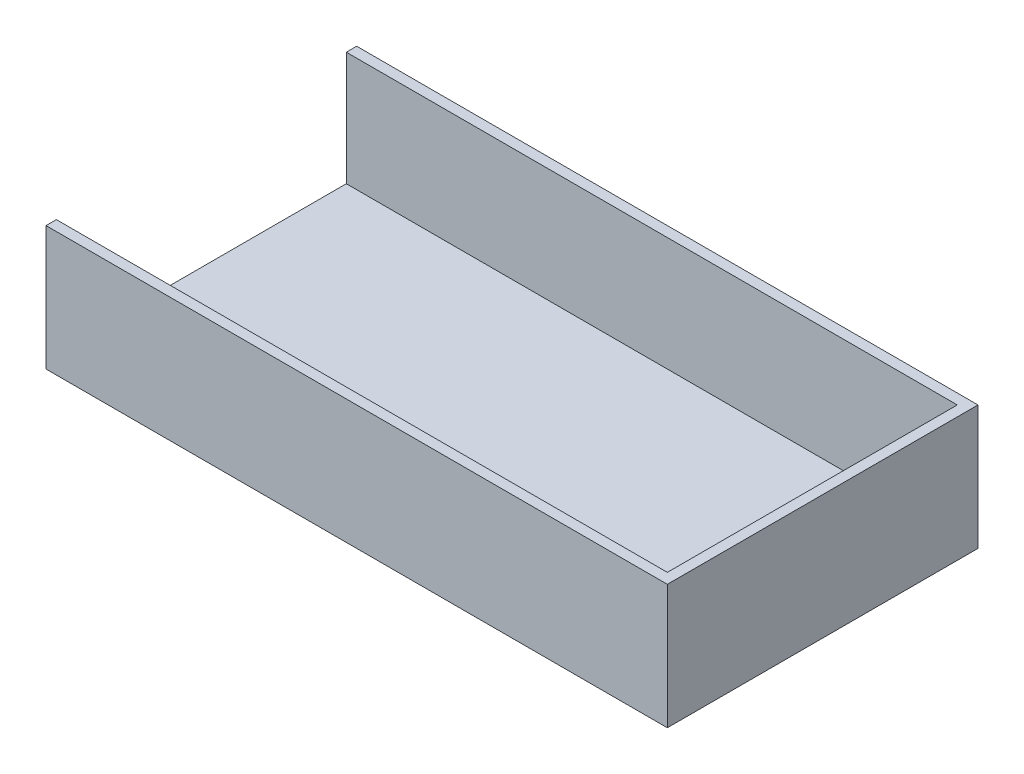
ISO-10303-21;
HEADER;
FILE_DESCRIPTION(('STEP AP214'),'2;1');
FILE_NAME('part.step','',(''),(''),'','','');
FILE_SCHEMA(('AUTOMOTIVE_DESIGN { 1 0 10303 214 1 1 1 1 }'));
ENDSEC;
DATA;
#1=APPLICATION_CONTEXT('core data for automotive mechanical design processes');
#2=APPLICATION_PROTOCOL_DEFINITION('international standard','automotive_design',2000,#1);
#3=PRODUCT_CONTEXT('',#1,'mechanical');
#4=PRODUCT('Part','Part','',(#3));
#5=PRODUCT_RELATED_PRODUCT_CATEGORY('part','',(#4));
#6=PRODUCT_DEFINITION_FORMATION('','',#4);
#7=PRODUCT_DEFINITION_CONTEXT('part definition',#1,'design');
#8=PRODUCT_DEFINITION('design','',#6,#7);
#9=PRODUCT_DEFINITION_SHAPE('','',#8);
#10=(LENGTH_UNIT() NAMED_UNIT(*) SI_UNIT(.MILLI.,.METRE.));
#11=(NAMED_UNIT(*) PLANE_ANGLE_UNIT() SI_UNIT($,.RADIAN.));
#12=(NAMED_UNIT(*) SI_UNIT($,.STERADIAN.) SOLID_ANGLE_UNIT());
#13=UNCERTAINTY_MEASURE_WITH_UNIT(LENGTH_MEASURE(1.E-05),#10,'distance_accuracy_value','');
#14=(GEOMETRIC_REPRESENTATION_CONTEXT(3) GLOBAL_UNCERTAINTY_ASSIGNED_CONTEXT((#13)) GLOBAL_UNIT_ASSIGNED_CONTEXT((#10,
#11,#12)) REPRESENTATION_CONTEXT('',''));
#15=CARTESIAN_POINT('',(0.,0.,0.));
#16=DIRECTION('',(0.,0.,1.));
#17=DIRECTION('',(1.,0.,0.));
#18=AXIS2_PLACEMENT_3D('',#15,#16,#17);
#19=CARTESIAN_POINT('',(0.,15.,35.));
#20=DIRECTION('',(0.,0.,1.));
#21=DIRECTION('',(1.,0.,0.));
#22=AXIS2_PLACEMENT_3D('',#19,#20,#21);
#23=PLANE('',#22);
#24=DIRECTION('',(-1.,0.,0.));
#25=VECTOR('',#24,1.);
#26=CARTESIAN_POINT('',(0.,-12.5,35.));
#27=LINE('',#26,#25);
#28=CARTESIAN_POINT('',(72.5,-12.5,35.));
#29=VERTEX_POINT('',#28);
#30=CARTESIAN_POINT('',(-75.,-12.5,35.));
#31=VERTEX_POINT('',#30);
#32=EDGE_CURVE('E53',#29,#31,#27,.T.);
#33=ORIENTED_EDGE('',*,*,#32,.T.);
#34=DIRECTION('',(0.,-1.,0.));
#35=VECTOR('',#34,1.);
#36=CARTESIAN_POINT('',(-75.,15.,35.));
#37=LINE('',#36,#35);
#38=CARTESIAN_POINT('',(-75.,15.,35.));
#39=VERTEX_POINT('',#38);
#40=EDGE_CURVE('E11',#39,#31,#37,.T.);
#41=ORIENTED_EDGE('',*,*,#40,.F.);
#42=DIRECTION('',(-1.,0.,0.));
#43=VECTOR('',#42,1.);
#44=CARTESIAN_POINT('',(0.,15.,35.));
#45=LINE('',#44,#43);
#46=CARTESIAN_POINT('',(72.5,15.,35.));
#47=VERTEX_POINT('',#46);
#48=EDGE_CURVE('E113',#47,#39,#45,.T.);
#49=ORIENTED_EDGE('',*,*,#48,.F.);
#50=DIRECTION('',(0.,-1.,0.));
#51=VECTOR('',#50,1.);
#52=CARTESIAN_POINT('',(72.5,15.,35.));
#53=LINE('',#52,#51);
#54=EDGE_CURVE('E174',#47,#29,#53,.T.);
#55=ORIENTED_EDGE('',*,*,#54,.T.);
#56=EDGE_LOOP('',(#33,#41,#49,#55));
#57=FACE_BOUND('',#56,.T.);
#58=ADVANCED_FACE('F39',(#57),#23,.F.);
#59=CARTESIAN_POINT('',(0.,15.,-35.));
#60=DIRECTION('',(0.,0.,1.));
#61=DIRECTION('',(1.,0.,0.));
#62=AXIS2_PLACEMENT_3D('',#59,#60,#61);
#63=PLANE('',#62);
#64=DIRECTION('',(0.,-1.,0.));
#65=VECTOR('',#64,1.);
#66=CARTESIAN_POINT('',(-75.,15.,-35.));
#67=LINE('',#66,#65);
#68=CARTESIAN_POINT('',(-75.,15.,-35.));
#69=VERTEX_POINT('',#68);
#70=CARTESIAN_POINT('',(-75.,-12.5,-35.));
#71=VERTEX_POINT('',#70);
#72=EDGE_CURVE('E60',#69,#71,#67,.T.);
#73=ORIENTED_EDGE('',*,*,#72,.T.);
#74=DIRECTION('',(-1.,0.,0.));
#75=VECTOR('',#74,1.);
#76=CARTESIAN_POINT('',(0.,-12.5,-35.));
#77=LINE('',#76,#75);
#78=CARTESIAN_POINT('',(72.5,-12.5,-35.));
#79=VERTEX_POINT('',#78);
#80=EDGE_CURVE('E163',#79,#71,#77,.T.);
#81=ORIENTED_EDGE('',*,*,#80,.F.);
#82=DIRECTION('',(0.,-1.,0.));
#83=VECTOR('',#82,1.);
#84=CARTESIAN_POINT('',(72.5,15.,-35.));
#85=LINE('',#84,#83);
#86=CARTESIAN_POINT('',(72.5,15.,-35.));
#87=VERTEX_POINT('',#86);
#88=EDGE_CURVE('E176',#87,#79,#85,.T.);
#89=ORIENTED_EDGE('',*,*,#88,.F.);
#90=DIRECTION('',(-1.,0.,0.));
#91=VECTOR('',#90,1.);
#92=CARTESIAN_POINT('',(0.,15.,-35.));
#93=LINE('',#92,#91);
#94=EDGE_CURVE('E193',#87,#69,#93,.T.);
#95=ORIENTED_EDGE('',*,*,#94,.T.);
#96=EDGE_LOOP('',(#73,#81,#89,#95));
#97=FACE_BOUND('',#96,.T.);
#98=ADVANCED_FACE('F125',(#97),#63,.T.);
#99=CARTESIAN_POINT('',(72.5,15.,0.));
#100=DIRECTION('',(1.,0.,0.));
#101=DIRECTION('',(0.,0.,-1.));
#102=AXIS2_PLACEMENT_3D('',#99,#100,#101);
#103=PLANE('',#102);
#104=DIRECTION('',(0.,0.,1.));
#105=VECTOR('',#104,1.);
#106=CARTESIAN_POINT('',(72.5,-12.5,0.));
#107=LINE('',#106,#105);
#108=EDGE_CURVE('E198',#79,#29,#107,.T.);
#109=ORIENTED_EDGE('',*,*,#108,.T.);
#110=ORIENTED_EDGE('',*,*,#54,.F.);
#111=DIRECTION('',(0.,0.,1.));
#112=VECTOR('',#111,1.);
#113=CARTESIAN_POINT('',(72.5,15.,0.));
#114=LINE('',#113,#112);
#115=EDGE_CURVE('E120',#87,#47,#114,.T.);
#116=ORIENTED_EDGE('',*,*,#115,.F.);
#117=ORIENTED_EDGE('',*,*,#88,.T.);
#118=EDGE_LOOP('',(#109,#110,#116,#117));
#119=FACE_BOUND('',#118,.T.);
#120=ADVANCED_FACE('F130',(#119),#103,.F.);
#121=CARTESIAN_POINT('',(0.,15.,37.5));
#122=DIRECTION('',(0.,0.,-1.));
#123=DIRECTION('',(-1.,0.,0.));
#124=AXIS2_PLACEMENT_3D('',#121,#122,#123);
#125=PLANE('',#124);
#126=DIRECTION('',(1.,0.,0.));
#127=VECTOR('',#126,1.);
#128=CARTESIAN_POINT('',(0.,-15.,37.5));
#129=LINE('',#128,#127);
#130=CARTESIAN_POINT('',(-75.,-15.,37.5));
#131=VERTEX_POINT('',#130);
#132=CARTESIAN_POINT('',(75.,-15.,37.5));
#133=VERTEX_POINT('',#132);
#134=EDGE_CURVE('E156',#131,#133,#129,.T.);
#135=ORIENTED_EDGE('',*,*,#134,.T.);
#136=DIRECTION('',(0.,-1.,0.));
#137=VECTOR('',#136,1.);
#138=CARTESIAN_POINT('',(75.,15.,37.5));
#139=LINE('',#138,#137);
#140=CARTESIAN_POINT('',(75.,15.,37.5));
#141=VERTEX_POINT('',#140);
#142=EDGE_CURVE('E158',#141,#133,#139,.T.);
#143=ORIENTED_EDGE('',*,*,#142,.F.);
#144=DIRECTION('',(1.,0.,0.));
#145=VECTOR('',#144,1.);
#146=CARTESIAN_POINT('',(0.,15.,37.5));
#147=LINE('',#146,#145);
#148=CARTESIAN_POINT('',(-75.,15.,37.5));
#149=VERTEX_POINT('',#148);
#150=EDGE_CURVE('E112',#149,#141,#147,.T.);
#151=ORIENTED_EDGE('',*,*,#150,.F.);
#152=DIRECTION('',(0.,-1.,0.));
#153=VECTOR('',#152,1.);
#154=CARTESIAN_POINT('',(-75.,15.,37.5));
#155=LINE('',#154,#153);
#156=EDGE_CURVE('E46',#149,#131,#155,.T.);
#157=ORIENTED_EDGE('',*,*,#156,.T.);
#158=EDGE_LOOP('',(#135,#143,#151,#157));
#159=FACE_BOUND('',#158,.T.);
#160=ADVANCED_FACE('F135',(#159),#125,.F.);
#161=CARTESIAN_POINT('',(75.,15.,0.));
#162=DIRECTION('',(1.,0.,0.));
#163=DIRECTION('',(0.,0.,-1.));
#164=AXIS2_PLACEMENT_3D('',#161,#162,#163);
#165=PLANE('',#164);
#166=DIRECTION('',(0.,0.,1.));
#167=VECTOR('',#166,1.);
#168=CARTESIAN_POINT('',(75.,-15.,0.));
#169=LINE('',#168,#167);
#170=CARTESIAN_POINT('',(75.,-15.,-37.5));
#171=VERTEX_POINT('',#170);
#172=EDGE_CURVE('E162',#171,#133,#169,.T.);
#173=ORIENTED_EDGE('',*,*,#172,.F.);
#174=DIRECTION('',(0.,-1.,0.));
#175=VECTOR('',#174,1.);
#176=CARTESIAN_POINT('',(75.,15.,-37.5));
#177=LINE('',#176,#175);
#178=CARTESIAN_POINT('',(75.,15.,-37.5));
#179=VERTEX_POINT('',#178);
#180=EDGE_CURVE('E182',#179,#171,#177,.T.);
#181=ORIENTED_EDGE('',*,*,#180,.F.);
#182=DIRECTION('',(0.,0.,1.));
#183=VECTOR('',#182,1.);
#184=CARTESIAN_POINT('',(75.,15.,0.));
#185=LINE('',#184,#183);
#186=EDGE_CURVE('E185',#179,#141,#185,.T.);
#187=ORIENTED_EDGE('',*,*,#186,.T.);
#188=ORIENTED_EDGE('',*,*,#142,.T.);
#189=EDGE_LOOP('',(#173,#181,#187,#188));
#190=FACE_BOUND('',#189,.T.);
#191=ADVANCED_FACE('F145',(#190),#165,.T.);
#192=CARTESIAN_POINT('',(0.,15.,-37.5));
#193=DIRECTION('',(0.,0.,-1.));
#194=DIRECTION('',(-1.,0.,0.));
#195=AXIS2_PLACEMENT_3D('',#192,#193,#194);
#196=PLANE('',#195);
#197=DIRECTION('',(1.,0.,0.));
#198=VECTOR('',#197,1.);
#199=CARTESIAN_POINT('',(0.,-15.,-37.5));
#200=LINE('',#199,#198);
#201=CARTESIAN_POINT('',(-75.,-15.,-37.5));
#202=VERTEX_POINT('',#201);
#203=EDGE_CURVE('E169',#202,#171,#200,.T.);
#204=ORIENTED_EDGE('',*,*,#203,.F.);
#205=DIRECTION('',(0.,-1.,0.));
#206=VECTOR('',#205,1.);
#207=CARTESIAN_POINT('',(-75.,15.,-37.5));
#208=LINE('',#207,#206);
#209=CARTESIAN_POINT('',(-75.,15.,-37.5));
#210=VERTEX_POINT('',#209);
#211=EDGE_CURVE('E180',#210,#202,#208,.T.);
#212=ORIENTED_EDGE('',*,*,#211,.F.);
#213=DIRECTION('',(1.,0.,0.));
#214=VECTOR('',#213,1.);
#215=CARTESIAN_POINT('',(0.,15.,-37.5));
#216=LINE('',#215,#214);
#217=EDGE_CURVE('E188',#210,#179,#216,.T.);
#218=ORIENTED_EDGE('',*,*,#217,.T.);
#219=ORIENTED_EDGE('',*,*,#180,.T.);
#220=EDGE_LOOP('',(#204,#212,#218,#219));
#221=FACE_BOUND('',#220,.T.);
#222=ADVANCED_FACE('F142',(#221),#196,.T.);
#223=CARTESIAN_POINT('',(-75.,15.,0.));
#224=DIRECTION('',(1.,0.,0.));
#225=DIRECTION('',(0.,0.,-1.));
#226=AXIS2_PLACEMENT_3D('',#223,#224,#225);
#227=PLANE('',#226);
#228=DIRECTION('',(0.,0.,1.));
#229=VECTOR('',#228,1.);
#230=CARTESIAN_POINT('',(-75.,-15.,0.));
#231=LINE('',#230,#229);
#232=EDGE_CURVE('E122',#202,#131,#231,.T.);
#233=ORIENTED_EDGE('',*,*,#232,.T.);
#234=ORIENTED_EDGE('',*,*,#156,.F.);
#235=DIRECTION('',(0.,0.,1.));
#236=VECTOR('',#235,1.);
#237=CARTESIAN_POINT('',(-75.,15.,0.));
#238=LINE('',#237,#236);
#239=EDGE_CURVE('E104',#39,#149,#238,.T.);
#240=ORIENTED_EDGE('',*,*,#239,.F.);
#241=ORIENTED_EDGE('',*,*,#40,.T.);
#242=DIRECTION('',(0.,0.,1.));
#243=VECTOR('',#242,1.);
#244=CARTESIAN_POINT('',(-75.,-12.5,0.));
#245=LINE('',#244,#243);
#246=EDGE_CURVE('E196',#71,#31,#245,.T.);
#247=ORIENTED_EDGE('',*,*,#246,.F.);
#248=ORIENTED_EDGE('',*,*,#72,.F.);
#249=EDGE_CURVE('E115',#210,#69,#238,.T.);
#250=ORIENTED_EDGE('',*,*,#249,.F.);
#251=ORIENTED_EDGE('',*,*,#211,.T.);
#252=EDGE_LOOP('',(#233,#234,#240,#241,#247,#248,#250,#251));
#253=FACE_BOUND('',#252,.T.);
#254=ADVANCED_FACE('F106',(#253),#227,.F.);
#255=CARTESIAN_POINT('',(0.,15.,0.));
#256=DIRECTION('',(0.,1.,0.));
#257=DIRECTION('',(0.,0.,1.));
#258=AXIS2_PLACEMENT_3D('',#255,#256,#257);
#259=PLANE('',#258);
#260=ORIENTED_EDGE('',*,*,#48,.T.);
#261=ORIENTED_EDGE('',*,*,#239,.T.);
#262=ORIENTED_EDGE('',*,*,#150,.T.);
#263=ORIENTED_EDGE('',*,*,#186,.F.);
#264=ORIENTED_EDGE('',*,*,#217,.F.);
#265=ORIENTED_EDGE('',*,*,#249,.T.);
#266=ORIENTED_EDGE('',*,*,#94,.F.);
#267=ORIENTED_EDGE('',*,*,#115,.T.);
#268=EDGE_LOOP('',(#260,#261,#262,#263,#264,#265,#266,#267));
#269=FACE_BOUND('',#268,.T.);
#270=ADVANCED_FACE('F117',(#269),#259,.T.);
#271=CARTESIAN_POINT('',(0.,-15.,0.));
#272=DIRECTION('',(0.,1.,0.));
#273=DIRECTION('',(0.,0.,1.));
#274=AXIS2_PLACEMENT_3D('',#271,#272,#273);
#275=PLANE('',#274);
#276=ORIENTED_EDGE('',*,*,#134,.F.);
#277=ORIENTED_EDGE('',*,*,#232,.F.);
#278=ORIENTED_EDGE('',*,*,#203,.T.);
#279=ORIENTED_EDGE('',*,*,#172,.T.);
#280=EDGE_LOOP('',(#276,#277,#278,#279));
#281=FACE_BOUND('',#280,.T.);
#282=ADVANCED_FACE('F167',(#281),#275,.F.);
#283=CARTESIAN_POINT('',(0.,-12.5,0.));
#284=DIRECTION('',(0.,-1.,0.));
#285=DIRECTION('',(0.,0.,-1.));
#286=AXIS2_PLACEMENT_3D('',#283,#284,#285);
#287=PLANE('',#286);
#288=ORIENTED_EDGE('',*,*,#108,.F.);
#289=ORIENTED_EDGE('',*,*,#80,.T.);
#290=ORIENTED_EDGE('',*,*,#246,.T.);
#291=ORIENTED_EDGE('',*,*,#32,.F.);
#292=EDGE_LOOP('',(#288,#289,#290,#291));
#293=FACE_BOUND('',#292,.T.);
#294=ADVANCED_FACE('F200',(#293),#287,.F.);
#295=CLOSED_SHELL('',(#58,#98,#120,#160,#191,#222,#254,#270,#282,#294));
#296=MANIFOLD_SOLID_BREP('B2',#295);
#297=ADVANCED_BREP_SHAPE_REPRESENTATION('',(#18,#296),#14);
#298=SHAPE_DEFINITION_REPRESENTATION(#9,#297);
ENDSEC;
END-ISO-10303-21;
